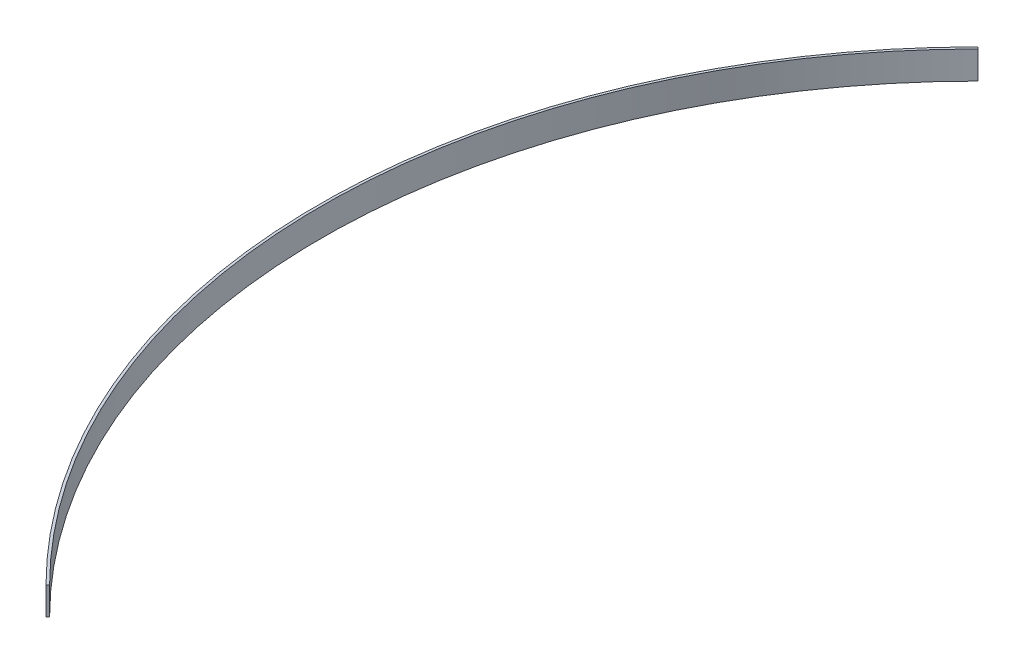
ISO-10303-21;
HEADER;
FILE_DESCRIPTION(('STEP AP214'),'2;1');
FILE_NAME('part.step','',(''),(''),'','','');
FILE_SCHEMA(('AUTOMOTIVE_DESIGN { 1 0 10303 214 1 1 1 1 }'));
ENDSEC;
DATA;
#1=APPLICATION_CONTEXT('core data for automotive mechanical design processes');
#2=APPLICATION_PROTOCOL_DEFINITION('international standard','automotive_design',2000,#1);
#3=PRODUCT_CONTEXT('',#1,'mechanical');
#4=PRODUCT('Part','Part','',(#3));
#5=PRODUCT_RELATED_PRODUCT_CATEGORY('part','',(#4));
#6=PRODUCT_DEFINITION_FORMATION('','',#4);
#7=PRODUCT_DEFINITION_CONTEXT('part definition',#1,'design');
#8=PRODUCT_DEFINITION('design','',#6,#7);
#9=PRODUCT_DEFINITION_SHAPE('','',#8);
#10=(LENGTH_UNIT() NAMED_UNIT(*) SI_UNIT(.MILLI.,.METRE.));
#11=(NAMED_UNIT(*) PLANE_ANGLE_UNIT() SI_UNIT($,.RADIAN.));
#12=(NAMED_UNIT(*) SI_UNIT($,.STERADIAN.) SOLID_ANGLE_UNIT());
#13=UNCERTAINTY_MEASURE_WITH_UNIT(LENGTH_MEASURE(1.E-05),#10,'distance_accuracy_value','');
#14=(GEOMETRIC_REPRESENTATION_CONTEXT(3) GLOBAL_UNCERTAINTY_ASSIGNED_CONTEXT((#13)) GLOBAL_UNIT_ASSIGNED_CONTEXT((#10,
#11,#12)) REPRESENTATION_CONTEXT('',''));
#15=CARTESIAN_POINT('',(0.,0.,0.));
#16=DIRECTION('',(0.,0.,1.));
#17=DIRECTION('',(1.,0.,0.));
#18=AXIS2_PLACEMENT_3D('',#15,#16,#17);
#19=CARTESIAN_POINT('',(-2.22044604925031E-13,3005.5,0.));
#20=DIRECTION('',(0.,1.,0.));
#21=DIRECTION('',(0.,0.,1.));
#22=AXIS2_PLACEMENT_3D('',#19,#20,#21);
#23=PLANE('',#22);
#24=DIRECTION('',(-0.707106781186546,0.,0.707106781186549));
#25=VECTOR('',#24,1.);
#26=CARTESIAN_POINT('',(-551.896842716099,3005.5,551.896842716102));
#27=LINE('',#26,#25);
#28=CARTESIAN_POINT('',(-549.775522372539,3005.5,549.775522372542));
#29=VERTEX_POINT('',#28);
#30=CARTESIAN_POINT('',(-551.896842716099,3005.5,551.896842716102));
#31=VERTEX_POINT('',#30);
#32=EDGE_CURVE('E11',#29,#31,#27,.T.);
#33=ORIENTED_EDGE('',*,*,#32,.F.);
#34=CARTESIAN_POINT('',(-2.22044604925031E-13,3005.5,0.));
#35=DIRECTION('',(0.,-1.,0.));
#36=DIRECTION('',(0.,0.,-1.));
#37=AXIS2_PLACEMENT_3D('',#34,#35,#36);
#38=CIRCLE('',#37,777.5);
#39=CARTESIAN_POINT('',(-549.77552237254,3005.5,-549.775522372541));
#40=VERTEX_POINT('',#39);
#41=EDGE_CURVE('E72',#29,#40,#38,.T.);
#42=ORIENTED_EDGE('',*,*,#41,.T.);
#43=DIRECTION('',(-0.707106781186547,0.,-0.707106781186548));
#44=VECTOR('',#43,1.);
#45=CARTESIAN_POINT('',(-551.8968427161,3005.5,-551.896842716101));
#46=LINE('',#45,#44);
#47=CARTESIAN_POINT('',(-551.8968427161,3005.5,-551.896842716101));
#48=VERTEX_POINT('',#47);
#49=EDGE_CURVE('E46',#40,#48,#46,.T.);
#50=ORIENTED_EDGE('',*,*,#49,.T.);
#51=CARTESIAN_POINT('',(-2.22044604925031E-13,3005.5,0.));
#52=DIRECTION('',(0.,-1.,0.));
#53=DIRECTION('',(0.,0.,-1.));
#54=AXIS2_PLACEMENT_3D('',#51,#52,#53);
#55=CIRCLE('',#54,780.5);
#56=EDGE_CURVE('E75',#31,#48,#55,.T.);
#57=ORIENTED_EDGE('',*,*,#56,.F.);
#58=EDGE_LOOP('',(#33,#42,#50,#57));
#59=FACE_BOUND('',#58,.T.);
#60=ADVANCED_FACE('F36',(#59),#23,.T.);
#61=CARTESIAN_POINT('',(-551.8968427161,2989.,-551.896842716101));
#62=DIRECTION('',(0.707106781186548,0.,-0.707106781186547));
#63=DIRECTION('',(0.,-1.,0.));
#64=AXIS2_PLACEMENT_3D('',#61,#62,#63);
#65=PLANE('',#64);
#66=ORIENTED_EDGE('',*,*,#49,.F.);
#67=DIRECTION('',(0.,-1.,0.));
#68=VECTOR('',#67,1.);
#69=CARTESIAN_POINT('',(-549.77552237254,4215.02623819779,-549.775522372541));
#70=LINE('',#69,#68);
#71=CARTESIAN_POINT('',(-549.77552237254,2972.5,-549.775522372541));
#72=VERTEX_POINT('',#71);
#73=EDGE_CURVE('E87',#40,#72,#70,.T.);
#74=ORIENTED_EDGE('',*,*,#73,.T.);
#75=DIRECTION('',(-0.707106781186547,0.,-0.707106781186548));
#76=VECTOR('',#75,1.);
#77=CARTESIAN_POINT('',(-551.8968427161,2972.5,-551.896842716101));
#78=LINE('',#77,#76);
#79=CARTESIAN_POINT('',(-551.8968427161,2972.5,-551.896842716101));
#80=VERTEX_POINT('',#79);
#81=EDGE_CURVE('E96',#72,#80,#78,.T.);
#82=ORIENTED_EDGE('',*,*,#81,.T.);
#83=DIRECTION('',(0.,-1.,0.));
#84=VECTOR('',#83,1.);
#85=CARTESIAN_POINT('',(-551.8968427161,3005.5,-551.896842716101));
#86=LINE('',#85,#84);
#87=EDGE_CURVE('E91',#48,#80,#86,.T.);
#88=ORIENTED_EDGE('',*,*,#87,.F.);
#89=EDGE_LOOP('',(#66,#74,#82,#88));
#90=FACE_BOUND('',#89,.T.);
#91=ADVANCED_FACE('F104',(#90),#65,.T.);
#92=CARTESIAN_POINT('',(-2.22044604925031E-13,2972.5,0.));
#93=DIRECTION('',(0.,-1.,0.));
#94=DIRECTION('',(0.,0.,-1.));
#95=AXIS2_PLACEMENT_3D('',#92,#93,#94);
#96=PLANE('',#95);
#97=ORIENTED_EDGE('',*,*,#81,.F.);
#98=CARTESIAN_POINT('',(-2.22044604925031E-13,2972.5,0.));
#99=DIRECTION('',(0.,-1.,0.));
#100=DIRECTION('',(0.,0.,-1.));
#101=AXIS2_PLACEMENT_3D('',#98,#99,#100);
#102=CIRCLE('',#101,777.5);
#103=CARTESIAN_POINT('',(-549.775522372539,2972.5,549.775522372542));
#104=VERTEX_POINT('',#103);
#105=EDGE_CURVE('E89',#72,#104,#102,.F.);
#106=ORIENTED_EDGE('',*,*,#105,.T.);
#107=DIRECTION('',(-0.707106781186546,0.,0.707106781186549));
#108=VECTOR('',#107,1.);
#109=CARTESIAN_POINT('',(-551.896842716099,2972.5,551.896842716102));
#110=LINE('',#109,#108);
#111=CARTESIAN_POINT('',(-551.896842716099,2972.5,551.896842716102));
#112=VERTEX_POINT('',#111);
#113=EDGE_CURVE('E40',#104,#112,#110,.T.);
#114=ORIENTED_EDGE('',*,*,#113,.T.);
#115=CARTESIAN_POINT('',(-2.22044604925031E-13,2972.5,0.));
#116=DIRECTION('',(0.,1.,0.));
#117=DIRECTION('',(0.,0.,1.));
#118=AXIS2_PLACEMENT_3D('',#115,#116,#117);
#119=CIRCLE('',#118,780.5);
#120=EDGE_CURVE('E105',#80,#112,#119,.T.);
#121=ORIENTED_EDGE('',*,*,#120,.F.);
#122=EDGE_LOOP('',(#97,#106,#114,#121));
#123=FACE_BOUND('',#122,.T.);
#124=ADVANCED_FACE('F109',(#123),#96,.T.);
#125=CARTESIAN_POINT('',(-551.896842716099,2989.,551.896842716102));
#126=DIRECTION('',(0.707106781186549,0.,0.707106781186546));
#127=DIRECTION('',(0.,1.,0.));
#128=AXIS2_PLACEMENT_3D('',#125,#126,#127);
#129=PLANE('',#128);
#130=DIRECTION('',(0.,-1.,0.));
#131=VECTOR('',#130,1.);
#132=CARTESIAN_POINT('',(-549.775522372539,4215.02623819779,549.775522372542));
#133=LINE('',#132,#131);
#134=EDGE_CURVE('E85',#104,#29,#133,.F.);
#135=ORIENTED_EDGE('',*,*,#134,.T.);
#136=ORIENTED_EDGE('',*,*,#32,.T.);
#137=DIRECTION('',(0.,1.,0.));
#138=VECTOR('',#137,1.);
#139=CARTESIAN_POINT('',(-551.896842716099,2972.5,551.896842716102));
#140=LINE('',#139,#138);
#141=EDGE_CURVE('E103',#112,#31,#140,.T.);
#142=ORIENTED_EDGE('',*,*,#141,.F.);
#143=ORIENTED_EDGE('',*,*,#113,.F.);
#144=EDGE_LOOP('',(#135,#136,#142,#143));
#145=FACE_BOUND('',#144,.T.);
#146=ADVANCED_FACE('F38',(#145),#129,.T.);
#147=CARTESIAN_POINT('',(-2.22044604925031E-13,4215.02623819779,0.));
#148=DIRECTION('',(0.,-1.,0.));
#149=DIRECTION('',(0.,0.,-1.));
#150=AXIS2_PLACEMENT_3D('',#147,#148,#149);
#151=CYLINDRICAL_SURFACE('',#150,780.5);
#152=ORIENTED_EDGE('',*,*,#120,.T.);
#153=ORIENTED_EDGE('',*,*,#141,.T.);
#154=ORIENTED_EDGE('',*,*,#56,.T.);
#155=ORIENTED_EDGE('',*,*,#87,.T.);
#156=EDGE_LOOP('',(#152,#153,#154,#155));
#157=FACE_BOUND('',#156,.T.);
#158=ADVANCED_FACE('F102',(#157),#151,.T.);
#159=CARTESIAN_POINT('',(-2.22044604925031E-13,4215.02623819779,0.));
#160=DIRECTION('',(0.,-1.,0.));
#161=DIRECTION('',(0.,0.,-1.));
#162=AXIS2_PLACEMENT_3D('',#159,#160,#161);
#163=CYLINDRICAL_SURFACE('',#162,777.5);
#164=ORIENTED_EDGE('',*,*,#105,.F.);
#165=ORIENTED_EDGE('',*,*,#73,.F.);
#166=ORIENTED_EDGE('',*,*,#41,.F.);
#167=ORIENTED_EDGE('',*,*,#134,.F.);
#168=EDGE_LOOP('',(#164,#165,#166,#167));
#169=FACE_BOUND('',#168,.T.);
#170=ADVANCED_FACE('F84',(#169),#163,.F.);
#171=CLOSED_SHELL('',(#60,#91,#124,#146,#158,#170));
#172=MANIFOLD_SOLID_BREP('B2',#171);
#173=ADVANCED_BREP_SHAPE_REPRESENTATION('',(#18,#172),#14);
#174=SHAPE_DEFINITION_REPRESENTATION(#9,#173);
ENDSEC;
END-ISO-10303-21;
